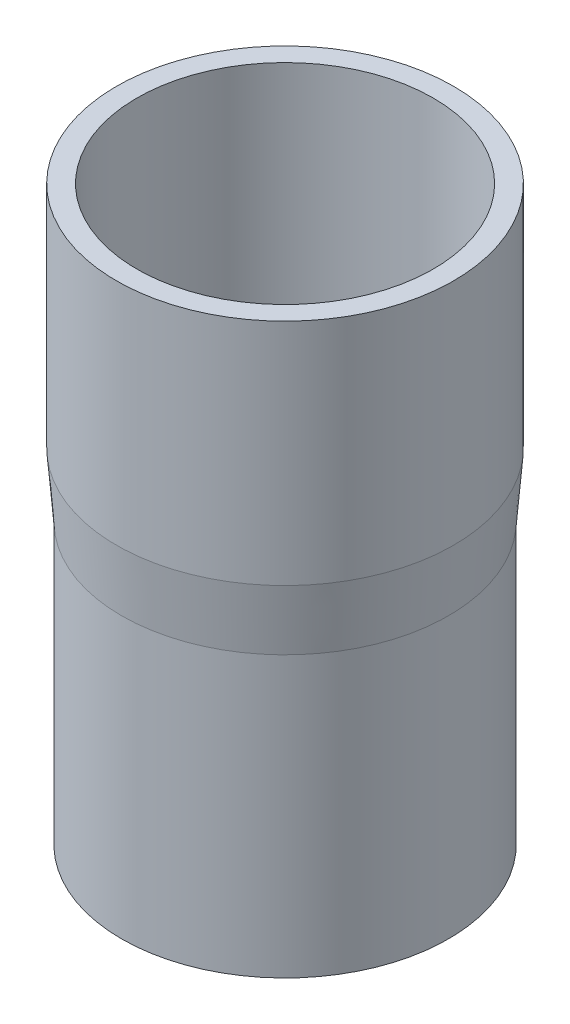
ISO-10303-21;
HEADER;
FILE_DESCRIPTION(('STEP AP214'),'2;1');
FILE_NAME('part.step','',(''),(''),'','','');
FILE_SCHEMA(('AUTOMOTIVE_DESIGN { 1 0 10303 214 1 1 1 1 }'));
ENDSEC;
DATA;
#1=APPLICATION_CONTEXT('core data for automotive mechanical design processes');
#2=APPLICATION_PROTOCOL_DEFINITION('international standard','automotive_design',2000,#1);
#3=PRODUCT_CONTEXT('',#1,'mechanical');
#4=PRODUCT('Part','Part','',(#3));
#5=PRODUCT_RELATED_PRODUCT_CATEGORY('part','',(#4));
#6=PRODUCT_DEFINITION_FORMATION('','',#4);
#7=PRODUCT_DEFINITION_CONTEXT('part definition',#1,'design');
#8=PRODUCT_DEFINITION('design','',#6,#7);
#9=PRODUCT_DEFINITION_SHAPE('','',#8);
#10=(LENGTH_UNIT() NAMED_UNIT(*) SI_UNIT(.MILLI.,.METRE.));
#11=(NAMED_UNIT(*) PLANE_ANGLE_UNIT() SI_UNIT($,.RADIAN.));
#12=(NAMED_UNIT(*) SI_UNIT($,.STERADIAN.) SOLID_ANGLE_UNIT());
#13=UNCERTAINTY_MEASURE_WITH_UNIT(LENGTH_MEASURE(1.E-05),#10,'distance_accuracy_value','');
#14=(GEOMETRIC_REPRESENTATION_CONTEXT(3) GLOBAL_UNCERTAINTY_ASSIGNED_CONTEXT((#13)) GLOBAL_UNIT_ASSIGNED_CONTEXT((#10,
#11,#12)) REPRESENTATION_CONTEXT('',''));
#15=CARTESIAN_POINT('',(0.,0.,0.));
#16=DIRECTION('',(0.,0.,1.));
#17=DIRECTION('',(1.,0.,0.));
#18=AXIS2_PLACEMENT_3D('',#15,#16,#17);
#19=CARTESIAN_POINT('',(0.,0.,0.));
#20=DIRECTION('',(0.,-1.,0.));
#21=DIRECTION('',(0.,0.,-1.));
#22=AXIS2_PLACEMENT_3D('',#19,#20,#21);
#23=CYLINDRICAL_SURFACE('',#22,11.25);
#24=CARTESIAN_POINT('',(0.,0.,0.));
#25=DIRECTION('',(0.,-1.,0.));
#26=DIRECTION('',(0.,0.,-1.));
#27=AXIS2_PLACEMENT_3D('',#24,#25,#26);
#28=CIRCLE('',#27,11.25);
#29=CARTESIAN_POINT('',(0.,0.,-11.25));
#30=VERTEX_POINT('',#29);
#31=EDGE_CURVE('E10',#30,#30,#28,.T.);
#32=ORIENTED_EDGE('',*,*,#31,.T.);
#33=EDGE_LOOP('',(#32));
#34=FACE_BOUND('',#33,.T.);
#35=CARTESIAN_POINT('',(0.,22.0638979263751,0.));
#36=DIRECTION('',(0.,-1.,0.));
#37=DIRECTION('',(0.,0.,-1.));
#38=AXIS2_PLACEMENT_3D('',#35,#36,#37);
#39=CIRCLE('',#38,11.25);
#40=CARTESIAN_POINT('',(0.,22.0638979263751,-11.25));
#41=VERTEX_POINT('',#40);
#42=EDGE_CURVE('E61',#41,#41,#39,.T.);
#43=ORIENTED_EDGE('',*,*,#42,.F.);
#44=EDGE_LOOP('',(#43));
#45=FACE_BOUND('',#44,.T.);
#46=ADVANCED_FACE('F33',(#34,#45),#23,.F.);
#47=CARTESIAN_POINT('',(-11.25,0.,0.));
#48=DIRECTION('',(0.,-1.,0.));
#49=DIRECTION('',(0.,0.,-1.));
#50=AXIS2_PLACEMENT_3D('',#47,#48,#49);
#51=PLANE('',#50);
#52=CARTESIAN_POINT('',(0.,0.,0.));
#53=DIRECTION('',(0.,-1.,0.));
#54=DIRECTION('',(0.,0.,-1.));
#55=AXIS2_PLACEMENT_3D('',#52,#53,#54);
#56=CIRCLE('',#55,12.85);
#57=CARTESIAN_POINT('',(0.,0.,-12.85));
#58=VERTEX_POINT('',#57);
#59=EDGE_CURVE('E39',#58,#58,#56,.T.);
#60=ORIENTED_EDGE('',*,*,#59,.T.);
#61=EDGE_LOOP('',(#60));
#62=FACE_BOUND('',#61,.T.);
#63=ORIENTED_EDGE('',*,*,#31,.F.);
#64=EDGE_LOOP('',(#63));
#65=FACE_BOUND('',#64,.T.);
#66=ADVANCED_FACE('F69',(#62,#65),#51,.T.);
#67=CARTESIAN_POINT('',(0.,0.,0.));
#68=DIRECTION('',(0.,-1.,0.));
#69=DIRECTION('',(0.,0.,-1.));
#70=AXIS2_PLACEMENT_3D('',#67,#68,#69);
#71=CYLINDRICAL_SURFACE('',#70,12.85);
#72=CARTESIAN_POINT('',(0.,22.,0.));
#73=DIRECTION('',(0.,-1.,0.));
#74=DIRECTION('',(0.,0.,-1.));
#75=AXIS2_PLACEMENT_3D('',#72,#73,#74);
#76=CIRCLE('',#75,12.85);
#77=CARTESIAN_POINT('',(0.,22.,-12.85));
#78=VERTEX_POINT('',#77);
#79=EDGE_CURVE('E43',#78,#78,#76,.T.);
#80=ORIENTED_EDGE('',*,*,#79,.T.);
#81=EDGE_LOOP('',(#80));
#82=FACE_BOUND('',#81,.T.);
#83=ORIENTED_EDGE('',*,*,#59,.F.);
#84=EDGE_LOOP('',(#83));
#85=FACE_BOUND('',#84,.T.);
#86=ADVANCED_FACE('F73',(#82,#85),#71,.T.);
#87=CARTESIAN_POINT('',(0.,22.,0.));
#88=DIRECTION('',(0.,1.,0.));
#89=DIRECTION('',(0.,0.,1.));
#90=AXIS2_PLACEMENT_3D('',#87,#88,#89);
#91=CONICAL_SURFACE('',#90,12.85,0.0798299857122375);
#92=CARTESIAN_POINT('',(0.,27.,0.));
#93=DIRECTION('',(0.,-1.,0.));
#94=DIRECTION('',(0.,0.,-1.));
#95=AXIS2_PLACEMENT_3D('',#92,#93,#94);
#96=CIRCLE('',#95,13.25);
#97=CARTESIAN_POINT('',(0.,27.,-13.25));
#98=VERTEX_POINT('',#97);
#99=EDGE_CURVE('E47',#98,#98,#96,.T.);
#100=ORIENTED_EDGE('',*,*,#99,.T.);
#101=EDGE_LOOP('',(#100));
#102=FACE_BOUND('',#101,.T.);
#103=ORIENTED_EDGE('',*,*,#79,.F.);
#104=EDGE_LOOP('',(#103));
#105=FACE_BOUND('',#104,.T.);
#106=ADVANCED_FACE('F77',(#102,#105),#91,.T.);
#107=CARTESIAN_POINT('',(0.,0.,0.));
#108=DIRECTION('',(0.,-1.,0.));
#109=DIRECTION('',(0.,0.,-1.));
#110=AXIS2_PLACEMENT_3D('',#107,#108,#109);
#111=CYLINDRICAL_SURFACE('',#110,13.25);
#112=CARTESIAN_POINT('',(0.,45.,0.));
#113=DIRECTION('',(0.,-1.,0.));
#114=DIRECTION('',(0.,0.,-1.));
#115=AXIS2_PLACEMENT_3D('',#112,#113,#114);
#116=CIRCLE('',#115,13.25);
#117=CARTESIAN_POINT('',(0.,45.,-13.25));
#118=VERTEX_POINT('',#117);
#119=EDGE_CURVE('E52',#118,#118,#116,.T.);
#120=ORIENTED_EDGE('',*,*,#119,.T.);
#121=EDGE_LOOP('',(#120));
#122=FACE_BOUND('',#121,.T.);
#123=ORIENTED_EDGE('',*,*,#99,.F.);
#124=EDGE_LOOP('',(#123));
#125=FACE_BOUND('',#124,.T.);
#126=ADVANCED_FACE('F84',(#122,#125),#111,.T.);
#127=CARTESIAN_POINT('',(-13.25,45.,0.));
#128=DIRECTION('',(0.,1.,0.));
#129=DIRECTION('',(0.,0.,1.));
#130=AXIS2_PLACEMENT_3D('',#127,#128,#129);
#131=PLANE('',#130);
#132=CARTESIAN_POINT('',(0.,45.,0.));
#133=DIRECTION('',(0.,-1.,0.));
#134=DIRECTION('',(0.,0.,-1.));
#135=AXIS2_PLACEMENT_3D('',#132,#133,#134);
#136=CIRCLE('',#135,11.65);
#137=CARTESIAN_POINT('',(0.,45.,-11.65));
#138=VERTEX_POINT('',#137);
#139=EDGE_CURVE('E55',#138,#138,#136,.T.);
#140=ORIENTED_EDGE('',*,*,#139,.T.);
#141=EDGE_LOOP('',(#140));
#142=FACE_BOUND('',#141,.T.);
#143=ORIENTED_EDGE('',*,*,#119,.F.);
#144=EDGE_LOOP('',(#143));
#145=FACE_BOUND('',#144,.T.);
#146=ADVANCED_FACE('F88',(#142,#145),#131,.T.);
#147=CARTESIAN_POINT('',(0.,0.,0.));
#148=DIRECTION('',(0.,-1.,0.));
#149=DIRECTION('',(0.,0.,-1.));
#150=AXIS2_PLACEMENT_3D('',#147,#148,#149);
#151=CYLINDRICAL_SURFACE('',#150,11.65);
#152=CARTESIAN_POINT('',(0.,27.0638979263751,0.));
#153=DIRECTION('',(0.,-1.,0.));
#154=DIRECTION('',(0.,0.,-1.));
#155=AXIS2_PLACEMENT_3D('',#152,#153,#154);
#156=CIRCLE('',#155,11.65);
#157=CARTESIAN_POINT('',(0.,27.0638979263751,-11.65));
#158=VERTEX_POINT('',#157);
#159=EDGE_CURVE('E58',#158,#158,#156,.T.);
#160=ORIENTED_EDGE('',*,*,#159,.T.);
#161=EDGE_LOOP('',(#160));
#162=FACE_BOUND('',#161,.T.);
#163=ORIENTED_EDGE('',*,*,#139,.F.);
#164=EDGE_LOOP('',(#163));
#165=FACE_BOUND('',#164,.T.);
#166=ADVANCED_FACE('F92',(#162,#165),#151,.F.);
#167=CARTESIAN_POINT('',(0.,27.0638979263751,0.));
#168=DIRECTION('',(0.,1.,0.));
#169=DIRECTION('',(0.,0.,1.));
#170=AXIS2_PLACEMENT_3D('',#167,#168,#169);
#171=CONICAL_SURFACE('',#170,11.65,0.0798299857122378);
#172=ORIENTED_EDGE('',*,*,#42,.T.);
#173=EDGE_LOOP('',(#172));
#174=FACE_BOUND('',#173,.T.);
#175=ORIENTED_EDGE('',*,*,#159,.F.);
#176=EDGE_LOOP('',(#175));
#177=FACE_BOUND('',#176,.T.);
#178=ADVANCED_FACE('F65',(#174,#177),#171,.F.);
#179=CLOSED_SHELL('',(#46,#66,#86,#106,#126,#146,#166,#178));
#180=MANIFOLD_SOLID_BREP('B2',#179);
#181=ADVANCED_BREP_SHAPE_REPRESENTATION('',(#18,#180),#14);
#182=SHAPE_DEFINITION_REPRESENTATION(#9,#181);
ENDSEC;
END-ISO-10303-21;
